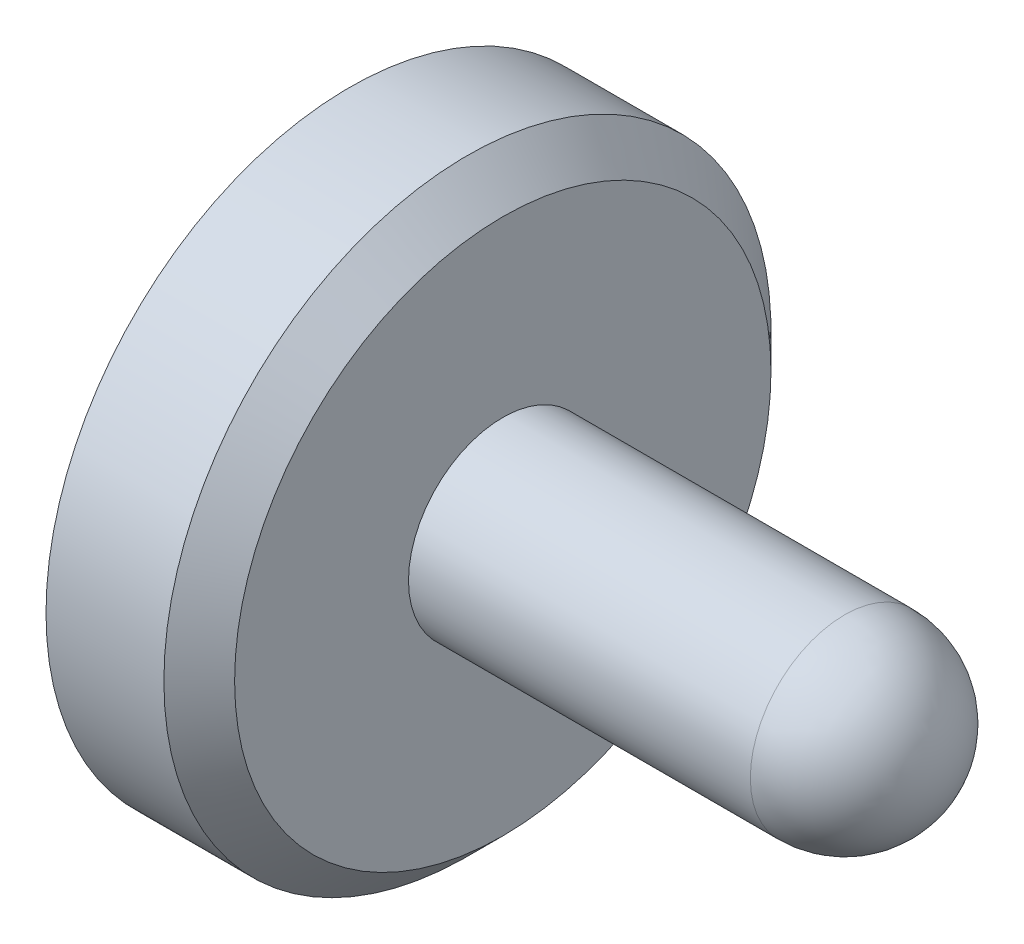
ISO-10303-21;
HEADER;
FILE_DESCRIPTION(('STEP AP214'),'2;1');
FILE_NAME('part.step','',(''),(''),'','','');
FILE_SCHEMA(('AUTOMOTIVE_DESIGN { 1 0 10303 214 1 1 1 1 }'));
ENDSEC;
DATA;
#1=APPLICATION_CONTEXT('core data for automotive mechanical design processes');
#2=APPLICATION_PROTOCOL_DEFINITION('international standard','automotive_design',2000,#1);
#3=PRODUCT_CONTEXT('',#1,'mechanical');
#4=PRODUCT('Part','Part','',(#3));
#5=PRODUCT_RELATED_PRODUCT_CATEGORY('part','',(#4));
#6=PRODUCT_DEFINITION_FORMATION('','',#4);
#7=PRODUCT_DEFINITION_CONTEXT('part definition',#1,'design');
#8=PRODUCT_DEFINITION('design','',#6,#7);
#9=PRODUCT_DEFINITION_SHAPE('','',#8);
#10=(LENGTH_UNIT() NAMED_UNIT(*) SI_UNIT(.MILLI.,.METRE.));
#11=(NAMED_UNIT(*) PLANE_ANGLE_UNIT() SI_UNIT($,.RADIAN.));
#12=(NAMED_UNIT(*) SI_UNIT($,.STERADIAN.) SOLID_ANGLE_UNIT());
#13=UNCERTAINTY_MEASURE_WITH_UNIT(LENGTH_MEASURE(1.E-05),#10,'distance_accuracy_value','');
#14=(GEOMETRIC_REPRESENTATION_CONTEXT(3) GLOBAL_UNCERTAINTY_ASSIGNED_CONTEXT((#13)) GLOBAL_UNIT_ASSIGNED_CONTEXT((#10,
#11,#12)) REPRESENTATION_CONTEXT('',''));
#15=CARTESIAN_POINT('',(0.,0.,0.));
#16=DIRECTION('',(0.,0.,1.));
#17=DIRECTION('',(1.,0.,0.));
#18=AXIS2_PLACEMENT_3D('',#15,#16,#17);
#19=CARTESIAN_POINT('',(1.0668,0.,0.));
#20=DIRECTION('',(-1.,0.,0.));
#21=DIRECTION('',(0.,1.,0.));
#22=AXIS2_PLACEMENT_3D('',#19,#20,#21);
#23=SPHERICAL_SURFACE('',#22,0.2032);
#24=CARTESIAN_POINT('',(1.0668,0.,0.));
#25=DIRECTION('',(-1.,0.,0.));
#26=DIRECTION('',(0.,0.,1.));
#27=AXIS2_PLACEMENT_3D('',#24,#25,#26);
#28=CIRCLE('',#27,0.2032);
#29=CARTESIAN_POINT('',(1.0668,0.,0.2032));
#30=VERTEX_POINT('',#29);
#31=EDGE_CURVE('E10',#30,#30,#28,.T.);
#32=ORIENTED_EDGE('',*,*,#31,.F.);
#33=EDGE_LOOP('',(#32));
#34=FACE_BOUND('',#33,.T.);
#35=ADVANCED_FACE('F31',(#34),#23,.T.);
#36=CARTESIAN_POINT('',(0.,0.,0.));
#37=DIRECTION('',(-1.,0.,0.));
#38=DIRECTION('',(0.,0.,1.));
#39=AXIS2_PLACEMENT_3D('',#36,#37,#38);
#40=CYLINDRICAL_SURFACE('',#39,0.2032);
#41=CARTESIAN_POINT('',(0.330200000000003,0.,0.));
#42=DIRECTION('',(-1.,0.,0.));
#43=DIRECTION('',(0.,0.,1.));
#44=AXIS2_PLACEMENT_3D('',#41,#42,#43);
#45=CIRCLE('',#44,0.2032);
#46=CARTESIAN_POINT('',(0.330200000000003,0.,0.2032));
#47=VERTEX_POINT('',#46);
#48=EDGE_CURVE('E37',#47,#47,#45,.T.);
#49=ORIENTED_EDGE('',*,*,#48,.F.);
#50=EDGE_LOOP('',(#49));
#51=FACE_BOUND('',#50,.T.);
#52=ORIENTED_EDGE('',*,*,#31,.T.);
#53=EDGE_LOOP('',(#52));
#54=FACE_BOUND('',#53,.T.);
#55=ADVANCED_FACE('F70',(#51,#54),#40,.T.);
#56=CARTESIAN_POINT('',(0.330200000000003,0.577850000000017,0.));
#57=DIRECTION('',(-1.,0.,0.));
#58=DIRECTION('',(0.,0.,1.));
#59=AXIS2_PLACEMENT_3D('',#56,#57,#58);
#60=PLANE('',#59);
#61=CARTESIAN_POINT('',(0.330200000000003,0.,0.));
#62=DIRECTION('',(-1.,0.,0.));
#63=DIRECTION('',(0.,0.,1.));
#64=AXIS2_PLACEMENT_3D('',#61,#62,#63);
#65=CIRCLE('',#64,0.577850000000017);
#66=CARTESIAN_POINT('',(0.330200000000003,0.,0.577850000000017));
#67=VERTEX_POINT('',#66);
#68=EDGE_CURVE('E41',#67,#67,#65,.T.);
#69=ORIENTED_EDGE('',*,*,#68,.F.);
#70=EDGE_LOOP('',(#69));
#71=FACE_BOUND('',#70,.T.);
#72=ORIENTED_EDGE('',*,*,#48,.T.);
#73=EDGE_LOOP('',(#72));
#74=FACE_BOUND('',#73,.T.);
#75=ADVANCED_FACE('F65',(#71,#74),#60,.F.);
#76=CARTESIAN_POINT('',(0.330200000000003,0.,0.));
#77=DIRECTION('',(-1.,0.,0.));
#78=DIRECTION('',(0.,0.,1.));
#79=AXIS2_PLACEMENT_3D('',#76,#77,#78);
#80=CONICAL_SURFACE('',#79,0.577850000000017,0.785398163397448);
#81=CARTESIAN_POINT('',(0.254000000000003,0.,0.));
#82=DIRECTION('',(-1.,0.,0.));
#83=DIRECTION('',(0.,0.,1.));
#84=AXIS2_PLACEMENT_3D('',#81,#82,#83);
#85=CIRCLE('',#84,0.654050000000017);
#86=CARTESIAN_POINT('',(0.254000000000003,0.,0.654050000000017));
#87=VERTEX_POINT('',#86);
#88=EDGE_CURVE('E45',#87,#87,#85,.T.);
#89=ORIENTED_EDGE('',*,*,#88,.F.);
#90=EDGE_LOOP('',(#89));
#91=FACE_BOUND('',#90,.T.);
#92=ORIENTED_EDGE('',*,*,#68,.T.);
#93=EDGE_LOOP('',(#92));
#94=FACE_BOUND('',#93,.T.);
#95=ADVANCED_FACE('F59',(#91,#94),#80,.T.);
#96=CARTESIAN_POINT('',(0.,0.,0.));
#97=DIRECTION('',(-1.,0.,0.));
#98=DIRECTION('',(0.,0.,1.));
#99=AXIS2_PLACEMENT_3D('',#96,#97,#98);
#100=CYLINDRICAL_SURFACE('',#99,0.654050000000017);
#101=CARTESIAN_POINT('',(0.,0.,0.));
#102=DIRECTION('',(-1.,0.,0.));
#103=DIRECTION('',(0.,0.,1.));
#104=AXIS2_PLACEMENT_3D('',#101,#102,#103);
#105=CIRCLE('',#104,0.654050000000017);
#106=CARTESIAN_POINT('',(0.,0.,0.654050000000017));
#107=VERTEX_POINT('',#106);
#108=EDGE_CURVE('E50',#107,#107,#105,.T.);
#109=ORIENTED_EDGE('',*,*,#108,.F.);
#110=EDGE_LOOP('',(#109));
#111=FACE_BOUND('',#110,.T.);
#112=ORIENTED_EDGE('',*,*,#88,.T.);
#113=EDGE_LOOP('',(#112));
#114=FACE_BOUND('',#113,.T.);
#115=ADVANCED_FACE('F56',(#111,#114),#100,.T.);
#116=CARTESIAN_POINT('',(0.,0.,0.));
#117=DIRECTION('',(1.,0.,0.));
#118=DIRECTION('',(0.,0.,-1.));
#119=AXIS2_PLACEMENT_3D('',#116,#117,#118);
#120=PLANE('',#119);
#121=ORIENTED_EDGE('',*,*,#108,.T.);
#122=EDGE_LOOP('',(#121));
#123=FACE_BOUND('',#122,.T.);
#124=ADVANCED_FACE('F54',(#123),#120,.F.);
#125=CLOSED_SHELL('',(#35,#55,#75,#95,#115,#124));
#126=MANIFOLD_SOLID_BREP('B2',#125);
#127=ADVANCED_BREP_SHAPE_REPRESENTATION('',(#18,#126),#14);
#128=SHAPE_DEFINITION_REPRESENTATION(#9,#127);
ENDSEC;
END-ISO-10303-21;
